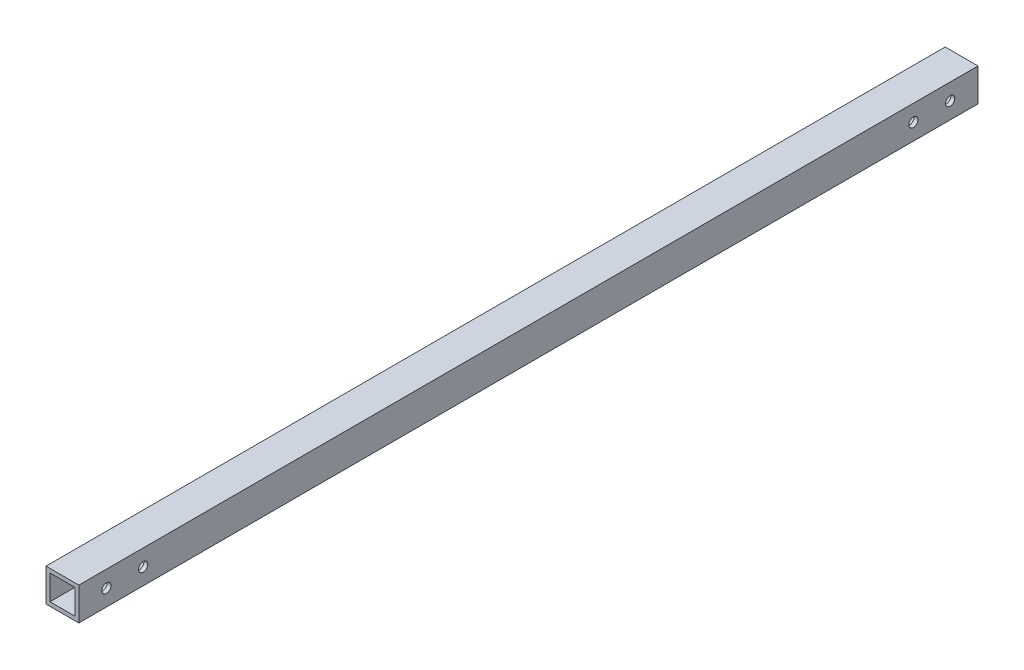
ISO-10303-21;
HEADER;
FILE_DESCRIPTION(('STEP AP214'),'2;1');
FILE_NAME('part.step','',(''),(''),'','','');
FILE_SCHEMA(('AUTOMOTIVE_DESIGN { 1 0 10303 214 1 1 1 1 }'));
ENDSEC;
DATA;
#1=APPLICATION_CONTEXT('core data for automotive mechanical design processes');
#2=APPLICATION_PROTOCOL_DEFINITION('international standard','automotive_design',2000,#1);
#3=PRODUCT_CONTEXT('',#1,'mechanical');
#4=PRODUCT('Part','Part','',(#3));
#5=PRODUCT_RELATED_PRODUCT_CATEGORY('part','',(#4));
#6=PRODUCT_DEFINITION_FORMATION('','',#4);
#7=PRODUCT_DEFINITION_CONTEXT('part definition',#1,'design');
#8=PRODUCT_DEFINITION('design','',#6,#7);
#9=PRODUCT_DEFINITION_SHAPE('','',#8);
#10=(LENGTH_UNIT() NAMED_UNIT(*) SI_UNIT(.MILLI.,.METRE.));
#11=(NAMED_UNIT(*) PLANE_ANGLE_UNIT() SI_UNIT($,.RADIAN.));
#12=(NAMED_UNIT(*) SI_UNIT($,.STERADIAN.) SOLID_ANGLE_UNIT());
#13=UNCERTAINTY_MEASURE_WITH_UNIT(LENGTH_MEASURE(1.E-05),#10,'distance_accuracy_value','');
#14=(GEOMETRIC_REPRESENTATION_CONTEXT(3) GLOBAL_UNCERTAINTY_ASSIGNED_CONTEXT((#13)) GLOBAL_UNIT_ASSIGNED_CONTEXT((#10,
#11,#12)) REPRESENTATION_CONTEXT('',''));
#15=CARTESIAN_POINT('',(0.,0.,0.));
#16=DIRECTION('',(0.,0.,1.));
#17=DIRECTION('',(1.,0.,0.));
#18=AXIS2_PLACEMENT_3D('',#15,#16,#17);
#19=CARTESIAN_POINT('',(0.,-25.,684.5));
#20=DIRECTION('',(0.,0.,1.));
#21=DIRECTION('',(1.,0.,0.));
#22=AXIS2_PLACEMENT_3D('',#19,#20,#21);
#23=PLANE('',#22);
#24=DIRECTION('',(0.,-1.,0.));
#25=VECTOR('',#24,1.);
#26=CARTESIAN_POINT('',(0.,0.,684.5));
#27=LINE('',#26,#25);
#28=CARTESIAN_POINT('',(0.,0.,684.5));
#29=VERTEX_POINT('',#28);
#30=CARTESIAN_POINT('',(0.,-25.,684.5));
#31=VERTEX_POINT('',#30);
#32=EDGE_CURVE('E140',#29,#31,#27,.T.);
#33=ORIENTED_EDGE('',*,*,#32,.T.);
#34=DIRECTION('',(1.,0.,0.));
#35=VECTOR('',#34,1.);
#36=CARTESIAN_POINT('',(0.,-25.,684.5));
#37=LINE('',#36,#35);
#38=CARTESIAN_POINT('',(25.,-25.,684.5));
#39=VERTEX_POINT('',#38);
#40=EDGE_CURVE('E143',#31,#39,#37,.T.);
#41=ORIENTED_EDGE('',*,*,#40,.T.);
#42=DIRECTION('',(0.,1.,0.));
#43=VECTOR('',#42,1.);
#44=CARTESIAN_POINT('',(25.,0.,684.5));
#45=LINE('',#44,#43);
#46=CARTESIAN_POINT('',(25.,0.,684.5));
#47=VERTEX_POINT('',#46);
#48=EDGE_CURVE('E146',#39,#47,#45,.T.);
#49=ORIENTED_EDGE('',*,*,#48,.T.);
#50=DIRECTION('',(-1.,0.,0.));
#51=VECTOR('',#50,1.);
#52=CARTESIAN_POINT('',(0.,0.,684.5));
#53=LINE('',#52,#51);
#54=EDGE_CURVE('E148',#47,#29,#53,.T.);
#55=ORIENTED_EDGE('',*,*,#54,.T.);
#56=EDGE_LOOP('',(#33,#41,#49,#55));
#57=FACE_BOUND('',#56,.T.);
#58=DIRECTION('',(1.,0.,0.));
#59=VECTOR('',#58,1.);
#60=CARTESIAN_POINT('',(3.,-22.,684.5));
#61=LINE('',#60,#59);
#62=CARTESIAN_POINT('',(3.,-22.,684.5));
#63=VERTEX_POINT('',#62);
#64=CARTESIAN_POINT('',(22.,-22.,684.5));
#65=VERTEX_POINT('',#64);
#66=EDGE_CURVE('E110',#63,#65,#61,.T.);
#67=ORIENTED_EDGE('',*,*,#66,.F.);
#68=DIRECTION('',(0.,-1.,0.));
#69=VECTOR('',#68,1.);
#70=CARTESIAN_POINT('',(3.,-3.,684.5));
#71=LINE('',#70,#69);
#72=CARTESIAN_POINT('',(3.,-3.,684.5));
#73=VERTEX_POINT('',#72);
#74=EDGE_CURVE('E102',#73,#63,#71,.T.);
#75=ORIENTED_EDGE('',*,*,#74,.F.);
#76=DIRECTION('',(-1.,0.,0.));
#77=VECTOR('',#76,1.);
#78=CARTESIAN_POINT('',(3.,-3.,684.5));
#79=LINE('',#78,#77);
#80=CARTESIAN_POINT('',(22.,-3.,684.5));
#81=VERTEX_POINT('',#80);
#82=EDGE_CURVE('E124',#81,#73,#79,.T.);
#83=ORIENTED_EDGE('',*,*,#82,.F.);
#84=DIRECTION('',(0.,1.,0.));
#85=VECTOR('',#84,1.);
#86=CARTESIAN_POINT('',(22.,-3.,684.5));
#87=LINE('',#86,#85);
#88=EDGE_CURVE('E122',#65,#81,#87,.T.);
#89=ORIENTED_EDGE('',*,*,#88,.F.);
#90=EDGE_LOOP('',(#67,#75,#83,#89));
#91=FACE_BOUND('',#90,.T.);
#92=ADVANCED_FACE('F35',(#57,#91),#23,.T.);
#93=CARTESIAN_POINT('',(0.,-25.,0.));
#94=DIRECTION('',(0.,0.,1.));
#95=DIRECTION('',(1.,0.,0.));
#96=AXIS2_PLACEMENT_3D('',#93,#94,#95);
#97=PLANE('',#96);
#98=DIRECTION('',(0.,-1.,0.));
#99=VECTOR('',#98,1.);
#100=CARTESIAN_POINT('',(0.,0.,0.));
#101=LINE('',#100,#99);
#102=CARTESIAN_POINT('',(0.,0.,0.));
#103=VERTEX_POINT('',#102);
#104=CARTESIAN_POINT('',(0.,-25.,0.));
#105=VERTEX_POINT('',#104);
#106=EDGE_CURVE('E118',#103,#105,#101,.T.);
#107=ORIENTED_EDGE('',*,*,#106,.F.);
#108=DIRECTION('',(-1.,0.,0.));
#109=VECTOR('',#108,1.);
#110=CARTESIAN_POINT('',(0.,0.,0.));
#111=LINE('',#110,#109);
#112=CARTESIAN_POINT('',(25.,0.,0.));
#113=VERTEX_POINT('',#112);
#114=EDGE_CURVE('E144',#113,#103,#111,.T.);
#115=ORIENTED_EDGE('',*,*,#114,.F.);
#116=DIRECTION('',(0.,1.,0.));
#117=VECTOR('',#116,1.);
#118=CARTESIAN_POINT('',(25.,0.,0.));
#119=LINE('',#118,#117);
#120=CARTESIAN_POINT('',(25.,-25.,0.));
#121=VERTEX_POINT('',#120);
#122=EDGE_CURVE('E155',#121,#113,#119,.T.);
#123=ORIENTED_EDGE('',*,*,#122,.F.);
#124=DIRECTION('',(1.,0.,0.));
#125=VECTOR('',#124,1.);
#126=CARTESIAN_POINT('',(0.,-25.,0.));
#127=LINE('',#126,#125);
#128=EDGE_CURVE('E153',#105,#121,#127,.T.);
#129=ORIENTED_EDGE('',*,*,#128,.F.);
#130=EDGE_LOOP('',(#107,#115,#123,#129));
#131=FACE_BOUND('',#130,.T.);
#132=DIRECTION('',(0.,-1.,0.));
#133=VECTOR('',#132,1.);
#134=CARTESIAN_POINT('',(3.,-3.,0.));
#135=LINE('',#134,#133);
#136=CARTESIAN_POINT('',(3.,-3.,0.));
#137=VERTEX_POINT('',#136);
#138=CARTESIAN_POINT('',(3.,-22.,0.));
#139=VERTEX_POINT('',#138);
#140=EDGE_CURVE('E60',#137,#139,#135,.T.);
#141=ORIENTED_EDGE('',*,*,#140,.T.);
#142=DIRECTION('',(1.,0.,0.));
#143=VECTOR('',#142,1.);
#144=CARTESIAN_POINT('',(3.,-22.,0.));
#145=LINE('',#144,#143);
#146=CARTESIAN_POINT('',(22.,-22.,0.));
#147=VERTEX_POINT('',#146);
#148=EDGE_CURVE('E117',#139,#147,#145,.T.);
#149=ORIENTED_EDGE('',*,*,#148,.T.);
#150=DIRECTION('',(0.,1.,0.));
#151=VECTOR('',#150,1.);
#152=CARTESIAN_POINT('',(22.,-3.,0.));
#153=LINE('',#152,#151);
#154=CARTESIAN_POINT('',(22.,-3.,0.));
#155=VERTEX_POINT('',#154);
#156=EDGE_CURVE('E132',#147,#155,#153,.T.);
#157=ORIENTED_EDGE('',*,*,#156,.T.);
#158=DIRECTION('',(-1.,0.,0.));
#159=VECTOR('',#158,1.);
#160=CARTESIAN_POINT('',(3.,-3.,0.));
#161=LINE('',#160,#159);
#162=EDGE_CURVE('E111',#155,#137,#161,.T.);
#163=ORIENTED_EDGE('',*,*,#162,.T.);
#164=EDGE_LOOP('',(#141,#149,#157,#163));
#165=FACE_BOUND('',#164,.T.);
#166=ADVANCED_FACE('F228',(#131,#165),#97,.F.);
#167=CARTESIAN_POINT('',(0.,0.,684.5));
#168=DIRECTION('',(1.,0.,0.));
#169=DIRECTION('',(0.,1.,0.));
#170=AXIS2_PLACEMENT_3D('',#167,#168,#169);
#171=PLANE('',#170);
#172=CARTESIAN_POINT('',(0.,-12.5,49.1799999999999));
#173=DIRECTION('',(1.,0.,0.));
#174=DIRECTION('',(0.,0.,-1.));
#175=AXIS2_PLACEMENT_3D('',#172,#173,#174);
#176=CIRCLE('',#175,3.49999999999999);
#177=CARTESIAN_POINT('',(0.,-12.5,45.6799999999999));
#178=VERTEX_POINT('',#177);
#179=EDGE_CURVE('E199',#178,#178,#176,.T.);
#180=ORIENTED_EDGE('',*,*,#179,.T.);
#181=EDGE_LOOP('',(#180));
#182=FACE_BOUND('',#181,.T.);
#183=CARTESIAN_POINT('',(0.,-12.5,21.1799999999999));
#184=DIRECTION('',(1.,0.,0.));
#185=DIRECTION('',(0.,0.,-1.));
#186=AXIS2_PLACEMENT_3D('',#183,#184,#185);
#187=CIRCLE('',#186,3.49999999999999);
#188=CARTESIAN_POINT('',(0.,-12.5,17.6799999999999));
#189=VERTEX_POINT('',#188);
#190=EDGE_CURVE('E187',#189,#189,#187,.T.);
#191=ORIENTED_EDGE('',*,*,#190,.T.);
#192=EDGE_LOOP('',(#191));
#193=FACE_BOUND('',#192,.T.);
#194=CARTESIAN_POINT('',(0.,-12.5,635.5));
#195=DIRECTION('',(1.,0.,0.));
#196=DIRECTION('',(0.,0.,-1.));
#197=AXIS2_PLACEMENT_3D('',#194,#195,#196);
#198=CIRCLE('',#197,3.49999999999999);
#199=CARTESIAN_POINT('',(0.,-12.5,632.));
#200=VERTEX_POINT('',#199);
#201=EDGE_CURVE('E181',#200,#200,#198,.T.);
#202=ORIENTED_EDGE('',*,*,#201,.T.);
#203=EDGE_LOOP('',(#202));
#204=FACE_BOUND('',#203,.T.);
#205=CARTESIAN_POINT('',(0.,-12.5,663.5));
#206=DIRECTION('',(1.,0.,0.));
#207=DIRECTION('',(0.,0.,-1.));
#208=AXIS2_PLACEMENT_3D('',#205,#206,#207);
#209=CIRCLE('',#208,3.49999999999999);
#210=CARTESIAN_POINT('',(0.,-12.5,660.));
#211=VERTEX_POINT('',#210);
#212=EDGE_CURVE('E166',#211,#211,#209,.T.);
#213=ORIENTED_EDGE('',*,*,#212,.T.);
#214=EDGE_LOOP('',(#213));
#215=FACE_BOUND('',#214,.T.);
#216=ORIENTED_EDGE('',*,*,#106,.T.);
#217=DIRECTION('',(0.,0.,-1.));
#218=VECTOR('',#217,1.);
#219=CARTESIAN_POINT('',(0.,-25.,684.5));
#220=LINE('',#219,#218);
#221=EDGE_CURVE('E11',#31,#105,#220,.T.);
#222=ORIENTED_EDGE('',*,*,#221,.F.);
#223=ORIENTED_EDGE('',*,*,#32,.F.);
#224=DIRECTION('',(0.,0.,-1.));
#225=VECTOR('',#224,1.);
#226=CARTESIAN_POINT('',(0.,0.,684.5));
#227=LINE('',#226,#225);
#228=EDGE_CURVE('E150',#29,#103,#227,.T.);
#229=ORIENTED_EDGE('',*,*,#228,.T.);
#230=EDGE_LOOP('',(#216,#222,#223,#229));
#231=FACE_BOUND('',#230,.T.);
#232=ADVANCED_FACE('F37',(#182,#193,#204,#215,#231),#171,.F.);
#233=CARTESIAN_POINT('',(0.,-25.,684.5));
#234=DIRECTION('',(0.,1.,0.));
#235=DIRECTION('',(0.,0.,1.));
#236=AXIS2_PLACEMENT_3D('',#233,#234,#235);
#237=PLANE('',#236);
#238=ORIENTED_EDGE('',*,*,#128,.T.);
#239=DIRECTION('',(0.,0.,-1.));
#240=VECTOR('',#239,1.);
#241=CARTESIAN_POINT('',(25.,-25.,684.5));
#242=LINE('',#241,#240);
#243=EDGE_CURVE('E44',#39,#121,#242,.T.);
#244=ORIENTED_EDGE('',*,*,#243,.F.);
#245=ORIENTED_EDGE('',*,*,#40,.F.);
#246=ORIENTED_EDGE('',*,*,#221,.T.);
#247=EDGE_LOOP('',(#238,#244,#245,#246));
#248=FACE_BOUND('',#247,.T.);
#249=ADVANCED_FACE('F254',(#248),#237,.F.);
#250=CARTESIAN_POINT('',(25.,0.,684.5));
#251=DIRECTION('',(-1.,0.,0.));
#252=DIRECTION('',(0.,-1.,0.));
#253=AXIS2_PLACEMENT_3D('',#250,#251,#252);
#254=PLANE('',#253);
#255=CARTESIAN_POINT('',(25.,-12.5,21.1799999999999));
#256=DIRECTION('',(1.,0.,0.));
#257=DIRECTION('',(0.,0.,-1.));
#258=AXIS2_PLACEMENT_3D('',#255,#256,#257);
#259=CIRCLE('',#258,3.5);
#260=CARTESIAN_POINT('',(25.,-12.5,17.6799999999999));
#261=VERTEX_POINT('',#260);
#262=EDGE_CURVE('E205',#261,#261,#259,.T.);
#263=ORIENTED_EDGE('',*,*,#262,.F.);
#264=EDGE_LOOP('',(#263));
#265=FACE_BOUND('',#264,.T.);
#266=CARTESIAN_POINT('',(25.,-12.5,49.1799999999999));
#267=DIRECTION('',(1.,0.,0.));
#268=DIRECTION('',(0.,0.,-1.));
#269=AXIS2_PLACEMENT_3D('',#266,#267,#268);
#270=CIRCLE('',#269,3.5);
#271=CARTESIAN_POINT('',(25.,-12.5,45.6799999999999));
#272=VERTEX_POINT('',#271);
#273=EDGE_CURVE('E193',#272,#272,#270,.T.);
#274=ORIENTED_EDGE('',*,*,#273,.F.);
#275=EDGE_LOOP('',(#274));
#276=FACE_BOUND('',#275,.T.);
#277=CARTESIAN_POINT('',(25.,-12.5,635.5));
#278=DIRECTION('',(1.,0.,0.));
#279=DIRECTION('',(0.,0.,-1.));
#280=AXIS2_PLACEMENT_3D('',#277,#278,#279);
#281=CIRCLE('',#280,3.5);
#282=CARTESIAN_POINT('',(25.,-12.5,632.));
#283=VERTEX_POINT('',#282);
#284=EDGE_CURVE('E184',#283,#283,#281,.T.);
#285=ORIENTED_EDGE('',*,*,#284,.F.);
#286=EDGE_LOOP('',(#285));
#287=FACE_BOUND('',#286,.T.);
#288=CARTESIAN_POINT('',(25.,-12.5,663.5));
#289=DIRECTION('',(1.,0.,0.));
#290=DIRECTION('',(0.,0.,-1.));
#291=AXIS2_PLACEMENT_3D('',#288,#289,#290);
#292=CIRCLE('',#291,3.5);
#293=CARTESIAN_POINT('',(25.,-12.5,660.));
#294=VERTEX_POINT('',#293);
#295=EDGE_CURVE('E171',#294,#294,#292,.T.);
#296=ORIENTED_EDGE('',*,*,#295,.F.);
#297=EDGE_LOOP('',(#296));
#298=FACE_BOUND('',#297,.T.);
#299=ORIENTED_EDGE('',*,*,#122,.T.);
#300=DIRECTION('',(0.,0.,-1.));
#301=VECTOR('',#300,1.);
#302=CARTESIAN_POINT('',(25.,0.,684.5));
#303=LINE('',#302,#301);
#304=EDGE_CURVE('E160',#47,#113,#303,.T.);
#305=ORIENTED_EDGE('',*,*,#304,.F.);
#306=ORIENTED_EDGE('',*,*,#48,.F.);
#307=ORIENTED_EDGE('',*,*,#243,.T.);
#308=EDGE_LOOP('',(#299,#305,#306,#307));
#309=FACE_BOUND('',#308,.T.);
#310=ADVANCED_FACE('F251',(#265,#276,#287,#298,#309),#254,.F.);
#311=CARTESIAN_POINT('',(0.,0.,684.5));
#312=DIRECTION('',(0.,-1.,0.));
#313=DIRECTION('',(0.,0.,-1.));
#314=AXIS2_PLACEMENT_3D('',#311,#312,#313);
#315=PLANE('',#314);
#316=ORIENTED_EDGE('',*,*,#114,.T.);
#317=ORIENTED_EDGE('',*,*,#228,.F.);
#318=ORIENTED_EDGE('',*,*,#54,.F.);
#319=ORIENTED_EDGE('',*,*,#304,.T.);
#320=EDGE_LOOP('',(#316,#317,#318,#319));
#321=FACE_BOUND('',#320,.T.);
#322=ADVANCED_FACE('F248',(#321),#315,.F.);
#323=CARTESIAN_POINT('',(3.,-3.,684.5));
#324=DIRECTION('',(1.,0.,0.));
#325=DIRECTION('',(0.,1.,0.));
#326=AXIS2_PLACEMENT_3D('',#323,#324,#325);
#327=PLANE('',#326);
#328=CARTESIAN_POINT('',(3.,-12.5,49.1799999999999));
#329=DIRECTION('',(1.,0.,0.));
#330=DIRECTION('',(0.,1.,0.));
#331=AXIS2_PLACEMENT_3D('',#328,#329,#330);
#332=CIRCLE('',#331,3.5);
#333=CARTESIAN_POINT('',(3.,-9.00000000000001,49.1799999999999));
#334=VERTEX_POINT('',#333);
#335=EDGE_CURVE('E202',#334,#334,#332,.T.);
#336=ORIENTED_EDGE('',*,*,#335,.F.);
#337=EDGE_LOOP('',(#336));
#338=FACE_BOUND('',#337,.T.);
#339=CARTESIAN_POINT('',(3.,-12.5,21.1799999999999));
#340=DIRECTION('',(1.,0.,0.));
#341=DIRECTION('',(0.,1.,0.));
#342=AXIS2_PLACEMENT_3D('',#339,#340,#341);
#343=CIRCLE('',#342,3.5);
#344=CARTESIAN_POINT('',(3.,-9.00000000000001,21.1799999999999));
#345=VERTEX_POINT('',#344);
#346=EDGE_CURVE('E190',#345,#345,#343,.T.);
#347=ORIENTED_EDGE('',*,*,#346,.F.);
#348=EDGE_LOOP('',(#347));
#349=FACE_BOUND('',#348,.T.);
#350=CARTESIAN_POINT('',(3.,-12.5,635.5));
#351=DIRECTION('',(1.,0.,0.));
#352=DIRECTION('',(0.,1.,0.));
#353=AXIS2_PLACEMENT_3D('',#350,#351,#352);
#354=CIRCLE('',#353,3.5);
#355=CARTESIAN_POINT('',(3.,-9.00000000000001,635.5));
#356=VERTEX_POINT('',#355);
#357=EDGE_CURVE('E176',#356,#356,#354,.T.);
#358=ORIENTED_EDGE('',*,*,#357,.F.);
#359=EDGE_LOOP('',(#358));
#360=FACE_BOUND('',#359,.T.);
#361=CARTESIAN_POINT('',(3.,-12.5,663.5));
#362=DIRECTION('',(1.,0.,0.));
#363=DIRECTION('',(0.,1.,0.));
#364=AXIS2_PLACEMENT_3D('',#361,#362,#363);
#365=CIRCLE('',#364,3.5);
#366=CARTESIAN_POINT('',(3.,-9.00000000000001,663.5));
#367=VERTEX_POINT('',#366);
#368=EDGE_CURVE('E130',#367,#367,#365,.T.);
#369=ORIENTED_EDGE('',*,*,#368,.F.);
#370=EDGE_LOOP('',(#369));
#371=FACE_BOUND('',#370,.T.);
#372=ORIENTED_EDGE('',*,*,#140,.F.);
#373=DIRECTION('',(0.,0.,-1.));
#374=VECTOR('',#373,1.);
#375=CARTESIAN_POINT('',(3.,-3.,684.5));
#376=LINE('',#375,#374);
#377=EDGE_CURVE('E106',#73,#137,#376,.T.);
#378=ORIENTED_EDGE('',*,*,#377,.F.);
#379=ORIENTED_EDGE('',*,*,#74,.T.);
#380=DIRECTION('',(0.,0.,-1.));
#381=VECTOR('',#380,1.);
#382=CARTESIAN_POINT('',(3.,-22.,684.5));
#383=LINE('',#382,#381);
#384=EDGE_CURVE('E105',#63,#139,#383,.T.);
#385=ORIENTED_EDGE('',*,*,#384,.T.);
#386=EDGE_LOOP('',(#372,#378,#379,#385));
#387=FACE_BOUND('',#386,.T.);
#388=ADVANCED_FACE('F104',(#338,#349,#360,#371,#387),#327,.T.);
#389=CARTESIAN_POINT('',(3.,-22.,684.5));
#390=DIRECTION('',(0.,1.,0.));
#391=DIRECTION('',(0.,0.,1.));
#392=AXIS2_PLACEMENT_3D('',#389,#390,#391);
#393=PLANE('',#392);
#394=ORIENTED_EDGE('',*,*,#148,.F.);
#395=ORIENTED_EDGE('',*,*,#384,.F.);
#396=ORIENTED_EDGE('',*,*,#66,.T.);
#397=DIRECTION('',(0.,0.,-1.));
#398=VECTOR('',#397,1.);
#399=CARTESIAN_POINT('',(22.,-22.,684.5));
#400=LINE('',#399,#398);
#401=EDGE_CURVE('E119',#65,#147,#400,.T.);
#402=ORIENTED_EDGE('',*,*,#401,.T.);
#403=EDGE_LOOP('',(#394,#395,#396,#402));
#404=FACE_BOUND('',#403,.T.);
#405=ADVANCED_FACE('F114',(#404),#393,.T.);
#406=CARTESIAN_POINT('',(22.,-3.,684.5));
#407=DIRECTION('',(-1.,0.,0.));
#408=DIRECTION('',(0.,-1.,0.));
#409=AXIS2_PLACEMENT_3D('',#406,#407,#408);
#410=PLANE('',#409);
#411=CARTESIAN_POINT('',(22.,-12.5,21.1799999999999));
#412=DIRECTION('',(-1.,0.,0.));
#413=DIRECTION('',(0.,-1.,0.));
#414=AXIS2_PLACEMENT_3D('',#411,#412,#413);
#415=CIRCLE('',#414,3.5);
#416=CARTESIAN_POINT('',(22.,-16.,21.1799999999999));
#417=VERTEX_POINT('',#416);
#418=EDGE_CURVE('E208',#417,#417,#415,.T.);
#419=ORIENTED_EDGE('',*,*,#418,.F.);
#420=EDGE_LOOP('',(#419));
#421=FACE_BOUND('',#420,.T.);
#422=CARTESIAN_POINT('',(22.,-12.5,49.1799999999999));
#423=DIRECTION('',(-1.,0.,0.));
#424=DIRECTION('',(0.,-1.,0.));
#425=AXIS2_PLACEMENT_3D('',#422,#423,#424);
#426=CIRCLE('',#425,3.5);
#427=CARTESIAN_POINT('',(22.,-16.,49.1799999999999));
#428=VERTEX_POINT('',#427);
#429=EDGE_CURVE('E196',#428,#428,#426,.T.);
#430=ORIENTED_EDGE('',*,*,#429,.F.);
#431=EDGE_LOOP('',(#430));
#432=FACE_BOUND('',#431,.T.);
#433=CARTESIAN_POINT('',(22.,-12.5,635.5));
#434=DIRECTION('',(-1.,0.,0.));
#435=DIRECTION('',(0.,-1.,0.));
#436=AXIS2_PLACEMENT_3D('',#433,#434,#435);
#437=CIRCLE('',#436,3.5);
#438=CARTESIAN_POINT('',(22.,-16.,635.5));
#439=VERTEX_POINT('',#438);
#440=EDGE_CURVE('E39',#439,#439,#437,.T.);
#441=ORIENTED_EDGE('',*,*,#440,.F.);
#442=EDGE_LOOP('',(#441));
#443=FACE_BOUND('',#442,.T.);
#444=CARTESIAN_POINT('',(22.,-12.5,663.5));
#445=DIRECTION('',(-1.,0.,0.));
#446=DIRECTION('',(0.,-1.,0.));
#447=AXIS2_PLACEMENT_3D('',#444,#445,#446);
#448=CIRCLE('',#447,3.5);
#449=CARTESIAN_POINT('',(22.,-16.,663.5));
#450=VERTEX_POINT('',#449);
#451=EDGE_CURVE('E164',#450,#450,#448,.T.);
#452=ORIENTED_EDGE('',*,*,#451,.F.);
#453=EDGE_LOOP('',(#452));
#454=FACE_BOUND('',#453,.T.);
#455=ORIENTED_EDGE('',*,*,#156,.F.);
#456=ORIENTED_EDGE('',*,*,#401,.F.);
#457=ORIENTED_EDGE('',*,*,#88,.T.);
#458=DIRECTION('',(0.,0.,-1.));
#459=VECTOR('',#458,1.);
#460=CARTESIAN_POINT('',(22.,-3.,684.5));
#461=LINE('',#460,#459);
#462=EDGE_CURVE('E52',#81,#155,#461,.T.);
#463=ORIENTED_EDGE('',*,*,#462,.T.);
#464=EDGE_LOOP('',(#455,#456,#457,#463));
#465=FACE_BOUND('',#464,.T.);
#466=ADVANCED_FACE('F215',(#421,#432,#443,#454,#465),#410,.T.);
#467=CARTESIAN_POINT('',(3.,-3.,684.5));
#468=DIRECTION('',(0.,-1.,0.));
#469=DIRECTION('',(0.,0.,-1.));
#470=AXIS2_PLACEMENT_3D('',#467,#468,#469);
#471=PLANE('',#470);
#472=ORIENTED_EDGE('',*,*,#162,.F.);
#473=ORIENTED_EDGE('',*,*,#462,.F.);
#474=ORIENTED_EDGE('',*,*,#82,.T.);
#475=ORIENTED_EDGE('',*,*,#377,.T.);
#476=EDGE_LOOP('',(#472,#473,#474,#475));
#477=FACE_BOUND('',#476,.T.);
#478=ADVANCED_FACE('F218',(#477),#471,.T.);
#479=CARTESIAN_POINT('',(25.,-12.5,663.5));
#480=DIRECTION('',(1.,0.,0.));
#481=DIRECTION('',(0.,0.,-1.));
#482=AXIS2_PLACEMENT_3D('',#479,#480,#481);
#483=CYLINDRICAL_SURFACE('',#482,3.5);
#484=ORIENTED_EDGE('',*,*,#451,.T.);
#485=EDGE_LOOP('',(#484));
#486=FACE_BOUND('',#485,.T.);
#487=ORIENTED_EDGE('',*,*,#295,.T.);
#488=EDGE_LOOP('',(#487));
#489=FACE_BOUND('',#488,.T.);
#490=ADVANCED_FACE('F230',(#486,#489),#483,.F.);
#491=ORIENTED_EDGE('',*,*,#368,.T.);
#492=EDGE_LOOP('',(#491));
#493=FACE_BOUND('',#492,.T.);
#494=ORIENTED_EDGE('',*,*,#212,.F.);
#495=EDGE_LOOP('',(#494));
#496=FACE_BOUND('',#495,.T.);
#497=ADVANCED_FACE('F235',(#493,#496),#483,.F.);
#498=CARTESIAN_POINT('',(25.,-12.5,635.5));
#499=DIRECTION('',(1.,0.,0.));
#500=DIRECTION('',(0.,0.,-1.));
#501=AXIS2_PLACEMENT_3D('',#498,#499,#500);
#502=CYLINDRICAL_SURFACE('',#501,3.5);
#503=ORIENTED_EDGE('',*,*,#440,.T.);
#504=EDGE_LOOP('',(#503));
#505=FACE_BOUND('',#504,.T.);
#506=ORIENTED_EDGE('',*,*,#284,.T.);
#507=EDGE_LOOP('',(#506));
#508=FACE_BOUND('',#507,.T.);
#509=ADVANCED_FACE('F285',(#505,#508),#502,.F.);
#510=ORIENTED_EDGE('',*,*,#357,.T.);
#511=EDGE_LOOP('',(#510));
#512=FACE_BOUND('',#511,.T.);
#513=ORIENTED_EDGE('',*,*,#201,.F.);
#514=EDGE_LOOP('',(#513));
#515=FACE_BOUND('',#514,.T.);
#516=ADVANCED_FACE('F282',(#512,#515),#502,.F.);
#517=CARTESIAN_POINT('',(25.,-12.5,21.1799999999999));
#518=DIRECTION('',(1.,0.,0.));
#519=DIRECTION('',(0.,0.,-1.));
#520=AXIS2_PLACEMENT_3D('',#517,#518,#519);
#521=CYLINDRICAL_SURFACE('',#520,3.5);
#522=ORIENTED_EDGE('',*,*,#346,.T.);
#523=EDGE_LOOP('',(#522));
#524=FACE_BOUND('',#523,.T.);
#525=ORIENTED_EDGE('',*,*,#190,.F.);
#526=EDGE_LOOP('',(#525));
#527=FACE_BOUND('',#526,.T.);
#528=ADVANCED_FACE('F284',(#524,#527),#521,.F.);
#529=CARTESIAN_POINT('',(25.,-12.5,49.1799999999999));
#530=DIRECTION('',(1.,0.,0.));
#531=DIRECTION('',(0.,0.,-1.));
#532=AXIS2_PLACEMENT_3D('',#529,#530,#531);
#533=CYLINDRICAL_SURFACE('',#532,3.5);
#534=ORIENTED_EDGE('',*,*,#429,.T.);
#535=EDGE_LOOP('',(#534));
#536=FACE_BOUND('',#535,.T.);
#537=ORIENTED_EDGE('',*,*,#273,.T.);
#538=EDGE_LOOP('',(#537));
#539=FACE_BOUND('',#538,.T.);
#540=ADVANCED_FACE('F292',(#536,#539),#533,.F.);
#541=CARTESIAN_POINT('',(25.,-12.5,49.1799999999999));
#542=DIRECTION('',(1.,0.,0.));
#543=DIRECTION('',(0.,0.,-1.));
#544=AXIS2_PLACEMENT_3D('',#541,#542,#543);
#545=CYLINDRICAL_SURFACE('',#544,3.5);
#546=ORIENTED_EDGE('',*,*,#335,.T.);
#547=EDGE_LOOP('',(#546));
#548=FACE_BOUND('',#547,.T.);
#549=ORIENTED_EDGE('',*,*,#179,.F.);
#550=EDGE_LOOP('',(#549));
#551=FACE_BOUND('',#550,.T.);
#552=ADVANCED_FACE('F299',(#548,#551),#545,.F.);
#553=CARTESIAN_POINT('',(25.,-12.5,21.1799999999999));
#554=DIRECTION('',(1.,0.,0.));
#555=DIRECTION('',(0.,0.,-1.));
#556=AXIS2_PLACEMENT_3D('',#553,#554,#555);
#557=CYLINDRICAL_SURFACE('',#556,3.5);
#558=ORIENTED_EDGE('',*,*,#418,.T.);
#559=EDGE_LOOP('',(#558));
#560=FACE_BOUND('',#559,.T.);
#561=ORIENTED_EDGE('',*,*,#262,.T.);
#562=EDGE_LOOP('',(#561));
#563=FACE_BOUND('',#562,.T.);
#564=ADVANCED_FACE('F212',(#560,#563),#557,.F.);
#565=CLOSED_SHELL('',(#92,#166,#232,#249,#310,#322,#388,#405,#466,#478,#490,#497,#509,#516,#528,
#540,#552,#564));
#566=MANIFOLD_SOLID_BREP('B2',#565);
#567=ADVANCED_BREP_SHAPE_REPRESENTATION('',(#18,#566),#14);
#568=SHAPE_DEFINITION_REPRESENTATION(#9,#567);
ENDSEC;
END-ISO-10303-21;
